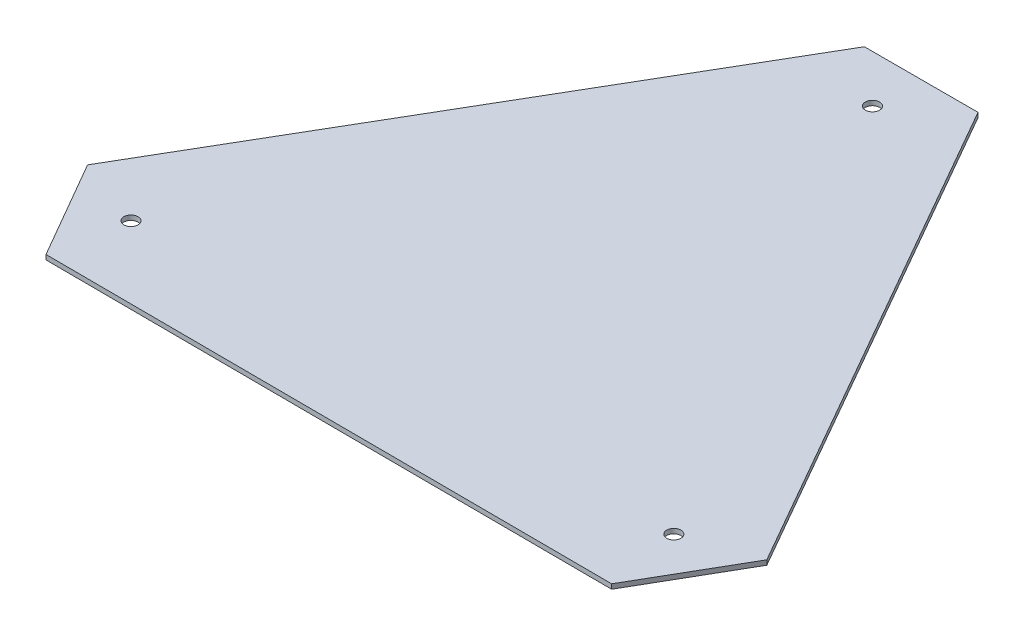
ISO-10303-21;
HEADER;
FILE_DESCRIPTION(('STEP AP214'),'2;1');
FILE_NAME('part.step','',(''),(''),'','','');
FILE_SCHEMA(('AUTOMOTIVE_DESIGN { 1 0 10303 214 1 1 1 1 }'));
ENDSEC;
DATA;
#1=APPLICATION_CONTEXT('core data for automotive mechanical design processes');
#2=APPLICATION_PROTOCOL_DEFINITION('international standard','automotive_design',2000,#1);
#3=PRODUCT_CONTEXT('',#1,'mechanical');
#4=PRODUCT('Part','Part','',(#3));
#5=PRODUCT_RELATED_PRODUCT_CATEGORY('part','',(#4));
#6=PRODUCT_DEFINITION_FORMATION('','',#4);
#7=PRODUCT_DEFINITION_CONTEXT('part definition',#1,'design');
#8=PRODUCT_DEFINITION('design','',#6,#7);
#9=PRODUCT_DEFINITION_SHAPE('','',#8);
#10=(LENGTH_UNIT() NAMED_UNIT(*) SI_UNIT(.MILLI.,.METRE.));
#11=(NAMED_UNIT(*) PLANE_ANGLE_UNIT() SI_UNIT($,.RADIAN.));
#12=(NAMED_UNIT(*) SI_UNIT($,.STERADIAN.) SOLID_ANGLE_UNIT());
#13=UNCERTAINTY_MEASURE_WITH_UNIT(LENGTH_MEASURE(1.E-05),#10,'distance_accuracy_value','');
#14=(GEOMETRIC_REPRESENTATION_CONTEXT(3) GLOBAL_UNCERTAINTY_ASSIGNED_CONTEXT((#13)) GLOBAL_UNIT_ASSIGNED_CONTEXT((#10,
#11,#12)) REPRESENTATION_CONTEXT('',''));
#15=CARTESIAN_POINT('',(0.,0.,0.));
#16=DIRECTION('',(0.,0.,1.));
#17=DIRECTION('',(1.,0.,0.));
#18=AXIS2_PLACEMENT_3D('',#15,#16,#17);
#19=CARTESIAN_POINT('',(0.,1.,0.));
#20=DIRECTION('',(0.,-1.,0.));
#21=DIRECTION('',(0.,0.,-1.));
#22=AXIS2_PLACEMENT_3D('',#19,#20,#21);
#23=PLANE('',#22);
#24=DIRECTION('',(-0.503676396020352,0.,0.863892405390828));
#25=VECTOR('',#24,1.);
#26=CARTESIAN_POINT('',(-11.7055270069749,1.,-76.2096097233338));
#27=LINE('',#26,#25);
#28=CARTESIAN_POINT('',(-11.7055270069749,1.,-76.2096097233338));
#29=VERTEX_POINT('',#28);
#30=CARTESIAN_POINT('',(-72.1466945294171,1.,27.4574789235655));
#31=VERTEX_POINT('',#30);
#32=EDGE_CURVE('E130',#29,#31,#27,.T.);
#33=ORIENTED_EDGE('',*,*,#32,.T.);
#34=DIRECTION('',(0.499999999999999,0.,0.866025403784439));
#35=VECTOR('',#34,1.);
#36=CARTESIAN_POINT('',(-60.1466945294171,1.,48.242088614392));
#37=LINE('',#36,#35);
#38=CARTESIAN_POINT('',(-60.1466945294171,1.,48.242088614392));
#39=VERTEX_POINT('',#38);
#40=EDGE_CURVE('E88',#31,#39,#37,.T.);
#41=ORIENTED_EDGE('',*,*,#40,.T.);
#42=DIRECTION('',(0.999990967215077,0.,0.0042503515448021));
#43=VECTOR('',#42,1.);
#44=CARTESIAN_POINT('',(-60.1466945294171,1.,48.242088614392));
#45=LINE('',#44,#43);
#46=CARTESIAN_POINT('',(59.8522215363921,1.,48.7521307997683));
#47=VERTEX_POINT('',#46);
#48=EDGE_CURVE('E101',#39,#47,#45,.T.);
#49=ORIENTED_EDGE('',*,*,#48,.T.);
#50=DIRECTION('',(0.500000000000001,0.,-0.866025403784438));
#51=VECTOR('',#50,1.);
#52=CARTESIAN_POINT('',(71.8522215363921,1.,27.9675211089418));
#53=LINE('',#52,#51);
#54=CARTESIAN_POINT('',(71.8522215363921,1.,27.9675211089418));
#55=VERTEX_POINT('',#54);
#56=EDGE_CURVE('E95',#47,#55,#53,.T.);
#57=ORIENTED_EDGE('',*,*,#56,.T.);
#58=DIRECTION('',(-0.496314571194725,0.,-0.86814275693563));
#59=VECTOR('',#58,1.);
#60=CARTESIAN_POINT('',(71.8522215363921,1.,27.9675211089418));
#61=LINE('',#60,#59);
#62=CARTESIAN_POINT('',(12.2944729930251,1.,-76.2096097233338));
#63=VERTEX_POINT('',#62);
#64=EDGE_CURVE('E99',#55,#63,#61,.T.);
#65=ORIENTED_EDGE('',*,*,#64,.T.);
#66=DIRECTION('',(-1.,0.,0.));
#67=VECTOR('',#66,1.);
#68=CARTESIAN_POINT('',(-11.7055270069749,1.,-76.2096097233338));
#69=LINE('',#68,#67);
#70=EDGE_CURVE('E51',#63,#29,#69,.T.);
#71=ORIENTED_EDGE('',*,*,#70,.T.);
#72=EDGE_LOOP('',(#33,#41,#49,#57,#65,#71));
#73=FACE_BOUND('',#72,.T.);
#74=CARTESIAN_POINT('',(0.,1.,-66.2096097233338));
#75=DIRECTION('',(0.,1.,0.));
#76=DIRECTION('',(0.,0.,1.));
#77=AXIS2_PLACEMENT_3D('',#74,#75,#76);
#78=CIRCLE('',#77,1.5);
#79=CARTESIAN_POINT('',(0.,1.,-64.7096097233338));
#80=VERTEX_POINT('',#79);
#81=EDGE_CURVE('E123',#80,#80,#78,.T.);
#82=ORIENTED_EDGE('',*,*,#81,.F.);
#83=EDGE_LOOP('',(#82));
#84=FACE_BOUND('',#83,.T.);
#85=CARTESIAN_POINT('',(57.3392039950645,1.,33.1048048616645));
#86=DIRECTION('',(0.,1.,0.));
#87=DIRECTION('',(0.,0.,1.));
#88=AXIS2_PLACEMENT_3D('',#85,#86,#87);
#89=CIRCLE('',#88,1.50000000000363);
#90=CARTESIAN_POINT('',(57.3392039950645,1.,34.6048048616681));
#91=VERTEX_POINT('',#90);
#92=EDGE_CURVE('E184',#91,#91,#89,.T.);
#93=ORIENTED_EDGE('',*,*,#92,.F.);
#94=EDGE_LOOP('',(#93));
#95=FACE_BOUND('',#94,.T.);
#96=CARTESIAN_POINT('',(-57.339203995056,1.,33.1048048616694));
#97=DIRECTION('',(0.,1.,0.));
#98=DIRECTION('',(0.,0.,1.));
#99=AXIS2_PLACEMENT_3D('',#96,#97,#98);
#100=CIRCLE('',#99,1.50000000000538);
#101=CARTESIAN_POINT('',(-57.339203995056,1.,34.6048048616747));
#102=VERTEX_POINT('',#101);
#103=EDGE_CURVE('E175',#102,#102,#100,.T.);
#104=ORIENTED_EDGE('',*,*,#103,.F.);
#105=EDGE_LOOP('',(#104));
#106=FACE_BOUND('',#105,.T.);
#107=ADVANCED_FACE('F34',(#73,#84,#95,#106),#23,.F.);
#108=CARTESIAN_POINT('',(0.,0.,0.));
#109=DIRECTION('',(0.,-1.,0.));
#110=DIRECTION('',(0.,0.,-1.));
#111=AXIS2_PLACEMENT_3D('',#108,#109,#110);
#112=PLANE('',#111);
#113=CARTESIAN_POINT('',(57.3392039950645,0.,33.1048048616645));
#114=DIRECTION('',(0.,1.,0.));
#115=DIRECTION('',(0.,0.,1.));
#116=AXIS2_PLACEMENT_3D('',#113,#114,#115);
#117=CIRCLE('',#116,1.50000000000363);
#118=CARTESIAN_POINT('',(57.3392039950645,0.,34.6048048616681));
#119=VERTEX_POINT('',#118);
#120=EDGE_CURVE('E181',#119,#119,#117,.T.);
#121=ORIENTED_EDGE('',*,*,#120,.T.);
#122=EDGE_LOOP('',(#121));
#123=FACE_BOUND('',#122,.T.);
#124=DIRECTION('',(-0.503676396020352,0.,0.863892405390828));
#125=VECTOR('',#124,1.);
#126=CARTESIAN_POINT('',(-11.7055270069749,0.,-76.2096097233338));
#127=LINE('',#126,#125);
#128=CARTESIAN_POINT('',(-11.7055270069749,0.,-76.2096097233338));
#129=VERTEX_POINT('',#128);
#130=CARTESIAN_POINT('',(-72.1466945294171,0.,27.4574789235655));
#131=VERTEX_POINT('',#130);
#132=EDGE_CURVE('E119',#129,#131,#127,.T.);
#133=ORIENTED_EDGE('',*,*,#132,.F.);
#134=DIRECTION('',(-1.,0.,0.));
#135=VECTOR('',#134,1.);
#136=CARTESIAN_POINT('',(-11.7055270069749,0.,-76.2096097233338));
#137=LINE('',#136,#135);
#138=CARTESIAN_POINT('',(12.2944729930251,0.,-76.2096097233338));
#139=VERTEX_POINT('',#138);
#140=EDGE_CURVE('E80',#139,#129,#137,.T.);
#141=ORIENTED_EDGE('',*,*,#140,.F.);
#142=DIRECTION('',(-0.496314571194725,0.,-0.86814275693563));
#143=VECTOR('',#142,1.);
#144=CARTESIAN_POINT('',(71.8522215363921,0.,27.9675211089418));
#145=LINE('',#144,#143);
#146=CARTESIAN_POINT('',(71.8522215363921,0.,27.9675211089418));
#147=VERTEX_POINT('',#146);
#148=EDGE_CURVE('E74',#147,#139,#145,.T.);
#149=ORIENTED_EDGE('',*,*,#148,.F.);
#150=DIRECTION('',(0.500000000000001,0.,-0.866025403784438));
#151=VECTOR('',#150,1.);
#152=CARTESIAN_POINT('',(71.8522215363921,0.,27.9675211089418));
#153=LINE('',#152,#151);
#154=CARTESIAN_POINT('',(59.8522215363921,0.,48.7521307997683));
#155=VERTEX_POINT('',#154);
#156=EDGE_CURVE('E109',#155,#147,#153,.T.);
#157=ORIENTED_EDGE('',*,*,#156,.F.);
#158=DIRECTION('',(0.999990967215077,0.,0.0042503515448021));
#159=VECTOR('',#158,1.);
#160=CARTESIAN_POINT('',(-60.1466945294171,0.,48.242088614392));
#161=LINE('',#160,#159);
#162=CARTESIAN_POINT('',(-60.1466945294171,0.,48.242088614392));
#163=VERTEX_POINT('',#162);
#164=EDGE_CURVE('E125',#163,#155,#161,.T.);
#165=ORIENTED_EDGE('',*,*,#164,.F.);
#166=DIRECTION('',(0.499999999999999,0.,0.866025403784439));
#167=VECTOR('',#166,1.);
#168=CARTESIAN_POINT('',(-60.1466945294171,0.,48.242088614392));
#169=LINE('',#168,#167);
#170=EDGE_CURVE('E122',#131,#163,#169,.T.);
#171=ORIENTED_EDGE('',*,*,#170,.F.);
#172=EDGE_LOOP('',(#133,#141,#149,#157,#165,#171));
#173=FACE_BOUND('',#172,.T.);
#174=CARTESIAN_POINT('',(0.,0.,-66.2096097233338));
#175=DIRECTION('',(0.,1.,0.));
#176=DIRECTION('',(0.,0.,1.));
#177=AXIS2_PLACEMENT_3D('',#174,#175,#176);
#178=CIRCLE('',#177,1.5);
#179=CARTESIAN_POINT('',(0.,0.,-64.7096097233338));
#180=VERTEX_POINT('',#179);
#181=EDGE_CURVE('E187',#180,#180,#178,.T.);
#182=ORIENTED_EDGE('',*,*,#181,.T.);
#183=EDGE_LOOP('',(#182));
#184=FACE_BOUND('',#183,.T.);
#185=CARTESIAN_POINT('',(-57.339203995056,0.,33.1048048616694));
#186=DIRECTION('',(0.,1.,0.));
#187=DIRECTION('',(0.,0.,1.));
#188=AXIS2_PLACEMENT_3D('',#185,#186,#187);
#189=CIRCLE('',#188,1.50000000000538);
#190=CARTESIAN_POINT('',(-57.339203995056,0.,34.6048048616747));
#191=VERTEX_POINT('',#190);
#192=EDGE_CURVE('E178',#191,#191,#189,.T.);
#193=ORIENTED_EDGE('',*,*,#192,.T.);
#194=EDGE_LOOP('',(#193));
#195=FACE_BOUND('',#194,.T.);
#196=ADVANCED_FACE('F139',(#123,#173,#184,#195),#112,.T.);
#197=CARTESIAN_POINT('',(-11.7055270069749,1.,-76.2096097233338));
#198=DIRECTION('',(0.863892405390828,0.,0.503676396020352));
#199=DIRECTION('',(0.503676396020352,0.,-0.863892405390828));
#200=AXIS2_PLACEMENT_3D('',#197,#198,#199);
#201=PLANE('',#200);
#202=ORIENTED_EDGE('',*,*,#132,.T.);
#203=DIRECTION('',(0.,-1.,0.));
#204=VECTOR('',#203,1.);
#205=CARTESIAN_POINT('',(-72.1466945294171,1.,27.4574789235655));
#206=LINE('',#205,#204);
#207=EDGE_CURVE('E11',#31,#131,#206,.T.);
#208=ORIENTED_EDGE('',*,*,#207,.F.);
#209=ORIENTED_EDGE('',*,*,#32,.F.);
#210=DIRECTION('',(0.,-1.,0.));
#211=VECTOR('',#210,1.);
#212=CARTESIAN_POINT('',(-11.7055270069749,1.,-76.2096097233338));
#213=LINE('',#212,#211);
#214=EDGE_CURVE('E115',#29,#129,#213,.T.);
#215=ORIENTED_EDGE('',*,*,#214,.T.);
#216=EDGE_LOOP('',(#202,#208,#209,#215));
#217=FACE_BOUND('',#216,.T.);
#218=ADVANCED_FACE('F36',(#217),#201,.F.);
#219=CARTESIAN_POINT('',(-60.1466945294171,1.,48.242088614392));
#220=DIRECTION('',(0.866025403784439,0.,-0.499999999999999));
#221=DIRECTION('',(-0.499999999999999,0.,-0.866025403784439));
#222=AXIS2_PLACEMENT_3D('',#219,#220,#221);
#223=PLANE('',#222);
#224=ORIENTED_EDGE('',*,*,#170,.T.);
#225=DIRECTION('',(0.,-1.,0.));
#226=VECTOR('',#225,1.);
#227=CARTESIAN_POINT('',(-60.1466945294171,1.,48.242088614392));
#228=LINE('',#227,#226);
#229=EDGE_CURVE('E43',#39,#163,#228,.T.);
#230=ORIENTED_EDGE('',*,*,#229,.F.);
#231=ORIENTED_EDGE('',*,*,#40,.F.);
#232=ORIENTED_EDGE('',*,*,#207,.T.);
#233=EDGE_LOOP('',(#224,#230,#231,#232));
#234=FACE_BOUND('',#233,.T.);
#235=ADVANCED_FACE('F238',(#234),#223,.F.);
#236=CARTESIAN_POINT('',(-60.1466945294171,1.,48.242088614392));
#237=DIRECTION('',(0.0042503515448021,0.,-0.999990967215077));
#238=DIRECTION('',(-0.999990967215077,0.,-0.0042503515448021));
#239=AXIS2_PLACEMENT_3D('',#236,#237,#238);
#240=PLANE('',#239);
#241=ORIENTED_EDGE('',*,*,#164,.T.);
#242=DIRECTION('',(0.,-1.,0.));
#243=VECTOR('',#242,1.);
#244=CARTESIAN_POINT('',(59.8522215363921,1.,48.7521307997683));
#245=LINE('',#244,#243);
#246=EDGE_CURVE('E110',#47,#155,#245,.T.);
#247=ORIENTED_EDGE('',*,*,#246,.F.);
#248=ORIENTED_EDGE('',*,*,#48,.F.);
#249=ORIENTED_EDGE('',*,*,#229,.T.);
#250=EDGE_LOOP('',(#241,#247,#248,#249));
#251=FACE_BOUND('',#250,.T.);
#252=ADVANCED_FACE('F136',(#251),#240,.F.);
#253=CARTESIAN_POINT('',(71.8522215363921,1.,27.9675211089418));
#254=DIRECTION('',(-0.866025403784438,0.,-0.500000000000001));
#255=DIRECTION('',(-0.500000000000001,0.,0.866025403784438));
#256=AXIS2_PLACEMENT_3D('',#253,#254,#255);
#257=PLANE('',#256);
#258=ORIENTED_EDGE('',*,*,#156,.T.);
#259=DIRECTION('',(0.,-1.,0.));
#260=VECTOR('',#259,1.);
#261=CARTESIAN_POINT('',(71.8522215363921,1.,27.9675211089418));
#262=LINE('',#261,#260);
#263=EDGE_CURVE('E106',#55,#147,#262,.T.);
#264=ORIENTED_EDGE('',*,*,#263,.F.);
#265=ORIENTED_EDGE('',*,*,#56,.F.);
#266=ORIENTED_EDGE('',*,*,#246,.T.);
#267=EDGE_LOOP('',(#258,#264,#265,#266));
#268=FACE_BOUND('',#267,.T.);
#269=ADVANCED_FACE('F107',(#268),#257,.F.);
#270=CARTESIAN_POINT('',(71.8522215363921,1.,27.9675211089418));
#271=DIRECTION('',(-0.86814275693563,0.,0.496314571194725));
#272=DIRECTION('',(0.496314571194725,0.,0.86814275693563));
#273=AXIS2_PLACEMENT_3D('',#270,#271,#272);
#274=PLANE('',#273);
#275=ORIENTED_EDGE('',*,*,#148,.T.);
#276=DIRECTION('',(0.,-1.,0.));
#277=VECTOR('',#276,1.);
#278=CARTESIAN_POINT('',(12.2944729930251,1.,-76.2096097233338));
#279=LINE('',#278,#277);
#280=EDGE_CURVE('E111',#63,#139,#279,.T.);
#281=ORIENTED_EDGE('',*,*,#280,.F.);
#282=ORIENTED_EDGE('',*,*,#64,.F.);
#283=ORIENTED_EDGE('',*,*,#263,.T.);
#284=EDGE_LOOP('',(#275,#281,#282,#283));
#285=FACE_BOUND('',#284,.T.);
#286=ADVANCED_FACE('F113',(#285),#274,.F.);
#287=CARTESIAN_POINT('',(-11.7055270069749,1.,-76.2096097233338));
#288=DIRECTION('',(0.,0.,1.));
#289=DIRECTION('',(1.,0.,0.));
#290=AXIS2_PLACEMENT_3D('',#287,#288,#289);
#291=PLANE('',#290);
#292=ORIENTED_EDGE('',*,*,#140,.T.);
#293=ORIENTED_EDGE('',*,*,#214,.F.);
#294=ORIENTED_EDGE('',*,*,#70,.F.);
#295=ORIENTED_EDGE('',*,*,#280,.T.);
#296=EDGE_LOOP('',(#292,#293,#294,#295));
#297=FACE_BOUND('',#296,.T.);
#298=ADVANCED_FACE('F144',(#297),#291,.F.);
#299=CARTESIAN_POINT('',(0.,1.,-66.2096097233338));
#300=DIRECTION('',(0.,-1.,0.));
#301=DIRECTION('',(0.,0.,-1.));
#302=AXIS2_PLACEMENT_3D('',#299,#300,#301);
#303=CYLINDRICAL_SURFACE('',#302,1.5);
#304=ORIENTED_EDGE('',*,*,#81,.T.);
#305=EDGE_LOOP('',(#304));
#306=FACE_BOUND('',#305,.T.);
#307=ORIENTED_EDGE('',*,*,#181,.F.);
#308=EDGE_LOOP('',(#307));
#309=FACE_BOUND('',#308,.T.);
#310=ADVANCED_FACE('F146',(#306,#309),#303,.F.);
#311=CARTESIAN_POINT('',(57.3392039950645,1.,33.1048048616645));
#312=DIRECTION('',(0.,-1.,0.));
#313=DIRECTION('',(0.,0.,-1.));
#314=AXIS2_PLACEMENT_3D('',#311,#312,#313);
#315=CYLINDRICAL_SURFACE('',#314,1.50000000000363);
#316=ORIENTED_EDGE('',*,*,#92,.T.);
#317=EDGE_LOOP('',(#316));
#318=FACE_BOUND('',#317,.T.);
#319=ORIENTED_EDGE('',*,*,#120,.F.);
#320=EDGE_LOOP('',(#319));
#321=FACE_BOUND('',#320,.T.);
#322=ADVANCED_FACE('F152',(#318,#321),#315,.F.);
#323=CARTESIAN_POINT('',(-57.339203995056,1.,33.1048048616694));
#324=DIRECTION('',(0.,-1.,0.));
#325=DIRECTION('',(0.,0.,-1.));
#326=AXIS2_PLACEMENT_3D('',#323,#324,#325);
#327=CYLINDRICAL_SURFACE('',#326,1.50000000000538);
#328=ORIENTED_EDGE('',*,*,#103,.T.);
#329=EDGE_LOOP('',(#328));
#330=FACE_BOUND('',#329,.T.);
#331=ORIENTED_EDGE('',*,*,#192,.F.);
#332=EDGE_LOOP('',(#331));
#333=FACE_BOUND('',#332,.T.);
#334=ADVANCED_FACE('F166',(#330,#333),#327,.F.);
#335=CLOSED_SHELL('',(#107,#196,#218,#235,#252,#269,#286,#298,#310,#322,#334));
#336=MANIFOLD_SOLID_BREP('B2',#335);
#337=ADVANCED_BREP_SHAPE_REPRESENTATION('',(#18,#336),#14);
#338=SHAPE_DEFINITION_REPRESENTATION(#9,#337);
ENDSEC;
END-ISO-10303-21;
